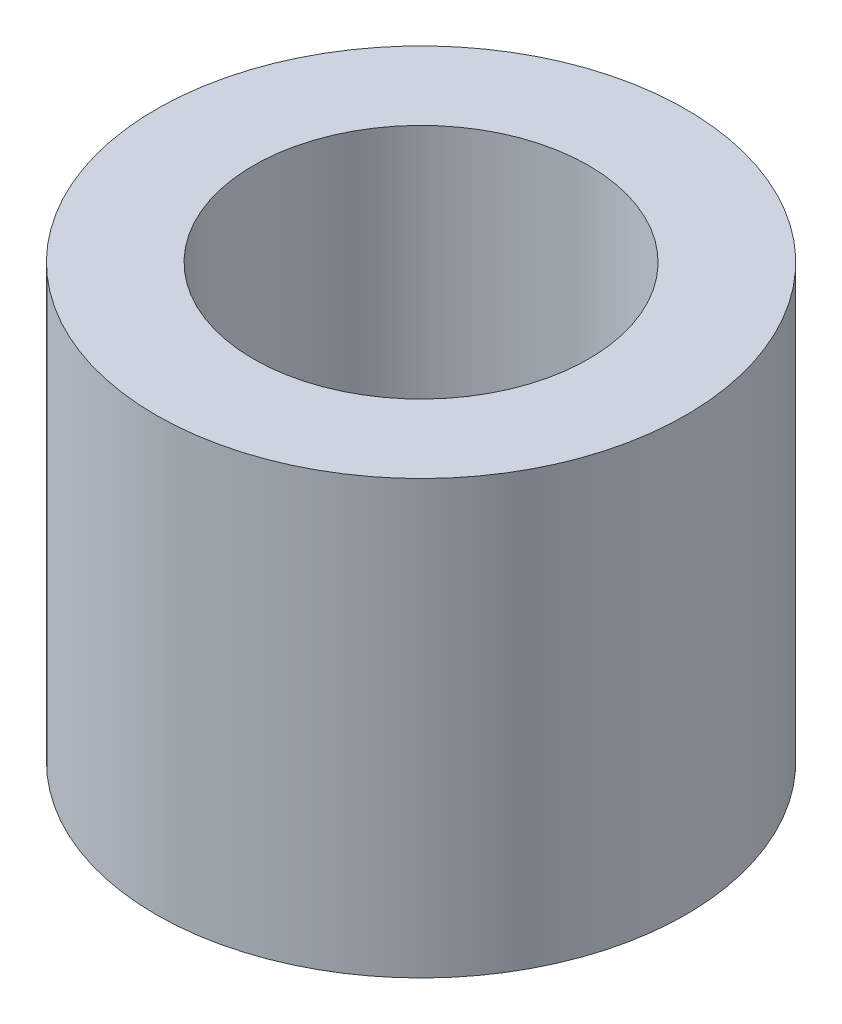
ISO-10303-21;
HEADER;
FILE_DESCRIPTION(('STEP AP214'),'2;1');
FILE_NAME('part.step','',(''),(''),'','','');
FILE_SCHEMA(('AUTOMOTIVE_DESIGN { 1 0 10303 214 1 1 1 1 }'));
ENDSEC;
DATA;
#1=APPLICATION_CONTEXT('core data for automotive mechanical design processes');
#2=APPLICATION_PROTOCOL_DEFINITION('international standard','automotive_design',2000,#1);
#3=PRODUCT_CONTEXT('',#1,'mechanical');
#4=PRODUCT('Part','Part','',(#3));
#5=PRODUCT_RELATED_PRODUCT_CATEGORY('part','',(#4));
#6=PRODUCT_DEFINITION_FORMATION('','',#4);
#7=PRODUCT_DEFINITION_CONTEXT('part definition',#1,'design');
#8=PRODUCT_DEFINITION('design','',#6,#7);
#9=PRODUCT_DEFINITION_SHAPE('','',#8);
#10=(LENGTH_UNIT() NAMED_UNIT(*) SI_UNIT(.MILLI.,.METRE.));
#11=(NAMED_UNIT(*) PLANE_ANGLE_UNIT() SI_UNIT($,.RADIAN.));
#12=(NAMED_UNIT(*) SI_UNIT($,.STERADIAN.) SOLID_ANGLE_UNIT());
#13=UNCERTAINTY_MEASURE_WITH_UNIT(LENGTH_MEASURE(1.E-05),#10,'distance_accuracy_value','');
#14=(GEOMETRIC_REPRESENTATION_CONTEXT(3) GLOBAL_UNCERTAINTY_ASSIGNED_CONTEXT((#13)) GLOBAL_UNIT_ASSIGNED_CONTEXT((#10,
#11,#12)) REPRESENTATION_CONTEXT('',''));
#15=CARTESIAN_POINT('',(0.,0.,0.));
#16=DIRECTION('',(0.,0.,1.));
#17=DIRECTION('',(1.,0.,0.));
#18=AXIS2_PLACEMENT_3D('',#15,#16,#17);
#19=CARTESIAN_POINT('',(0.,4.,0.));
#20=DIRECTION('',(0.,-1.,0.));
#21=DIRECTION('',(0.,0.,-1.));
#22=AXIS2_PLACEMENT_3D('',#19,#20,#21);
#23=CYLINDRICAL_SURFACE('',#22,2.45);
#24=CARTESIAN_POINT('',(0.,4.,0.));
#25=DIRECTION('',(0.,1.,0.));
#26=DIRECTION('',(0.,0.,1.));
#27=AXIS2_PLACEMENT_3D('',#24,#25,#26);
#28=CIRCLE('',#27,2.45);
#29=CARTESIAN_POINT('',(0.,4.,2.45));
#30=VERTEX_POINT('',#29);
#31=EDGE_CURVE('E10',#30,#30,#28,.T.);
#32=ORIENTED_EDGE('',*,*,#31,.F.);
#33=EDGE_LOOP('',(#32));
#34=FACE_BOUND('',#33,.T.);
#35=CARTESIAN_POINT('',(0.,0.,0.));
#36=DIRECTION('',(0.,1.,0.));
#37=DIRECTION('',(0.,0.,1.));
#38=AXIS2_PLACEMENT_3D('',#35,#36,#37);
#39=CIRCLE('',#38,2.45);
#40=CARTESIAN_POINT('',(0.,0.,2.45));
#41=VERTEX_POINT('',#40);
#42=EDGE_CURVE('E34',#41,#41,#39,.T.);
#43=ORIENTED_EDGE('',*,*,#42,.T.);
#44=EDGE_LOOP('',(#43));
#45=FACE_BOUND('',#44,.T.);
#46=ADVANCED_FACE('F31',(#34,#45),#23,.T.);
#47=CARTESIAN_POINT('',(0.,4.,0.));
#48=DIRECTION('',(0.,1.,0.));
#49=DIRECTION('',(0.,0.,1.));
#50=AXIS2_PLACEMENT_3D('',#47,#48,#49);
#51=PLANE('',#50);
#52=CARTESIAN_POINT('',(0.,4.,0.));
#53=DIRECTION('',(0.,1.,0.));
#54=DIRECTION('',(0.,0.,1.));
#55=AXIS2_PLACEMENT_3D('',#52,#53,#54);
#56=CIRCLE('',#55,1.55);
#57=CARTESIAN_POINT('',(0.,4.,1.55));
#58=VERTEX_POINT('',#57);
#59=EDGE_CURVE('E43',#58,#58,#56,.T.);
#60=ORIENTED_EDGE('',*,*,#59,.F.);
#61=EDGE_LOOP('',(#60));
#62=FACE_BOUND('',#61,.T.);
#63=ORIENTED_EDGE('',*,*,#31,.T.);
#64=EDGE_LOOP('',(#63));
#65=FACE_BOUND('',#64,.T.);
#66=ADVANCED_FACE('F58',(#62,#65),#51,.T.);
#67=CARTESIAN_POINT('',(0.,0.,0.));
#68=DIRECTION('',(0.,1.,0.));
#69=DIRECTION('',(0.,0.,1.));
#70=AXIS2_PLACEMENT_3D('',#67,#68,#69);
#71=PLANE('',#70);
#72=ORIENTED_EDGE('',*,*,#42,.F.);
#73=EDGE_LOOP('',(#72));
#74=FACE_BOUND('',#73,.T.);
#75=ADVANCED_FACE('F54',(#74),#71,.F.);
#76=CARTESIAN_POINT('',(0.,1.,0.));
#77=DIRECTION('',(0.,1.,0.));
#78=DIRECTION('',(0.,0.,1.));
#79=AXIS2_PLACEMENT_3D('',#76,#77,#78);
#80=CYLINDRICAL_SURFACE('',#79,1.55);
#81=CARTESIAN_POINT('',(0.,1.,0.));
#82=DIRECTION('',(0.,1.,0.));
#83=DIRECTION('',(0.,0.,1.));
#84=AXIS2_PLACEMENT_3D('',#81,#82,#83);
#85=CIRCLE('',#84,1.55);
#86=CARTESIAN_POINT('',(0.,1.,1.55));
#87=VERTEX_POINT('',#86);
#88=EDGE_CURVE('E41',#87,#87,#85,.T.);
#89=ORIENTED_EDGE('',*,*,#88,.F.);
#90=EDGE_LOOP('',(#89));
#91=FACE_BOUND('',#90,.T.);
#92=ORIENTED_EDGE('',*,*,#59,.T.);
#93=EDGE_LOOP('',(#92));
#94=FACE_BOUND('',#93,.T.);
#95=ADVANCED_FACE('F51',(#91,#94),#80,.F.);
#96=CARTESIAN_POINT('',(0.,1.,0.));
#97=DIRECTION('',(0.,1.,0.));
#98=DIRECTION('',(0.,0.,1.));
#99=AXIS2_PLACEMENT_3D('',#96,#97,#98);
#100=PLANE('',#99);
#101=ORIENTED_EDGE('',*,*,#88,.T.);
#102=EDGE_LOOP('',(#101));
#103=FACE_BOUND('',#102,.T.);
#104=ADVANCED_FACE('F49',(#103),#100,.T.);
#105=CLOSED_SHELL('',(#46,#66,#75,#95,#104));
#106=MANIFOLD_SOLID_BREP('B2',#105);
#107=ADVANCED_BREP_SHAPE_REPRESENTATION('',(#18,#106),#14);
#108=SHAPE_DEFINITION_REPRESENTATION(#9,#107);
ENDSEC;
END-ISO-10303-21;
